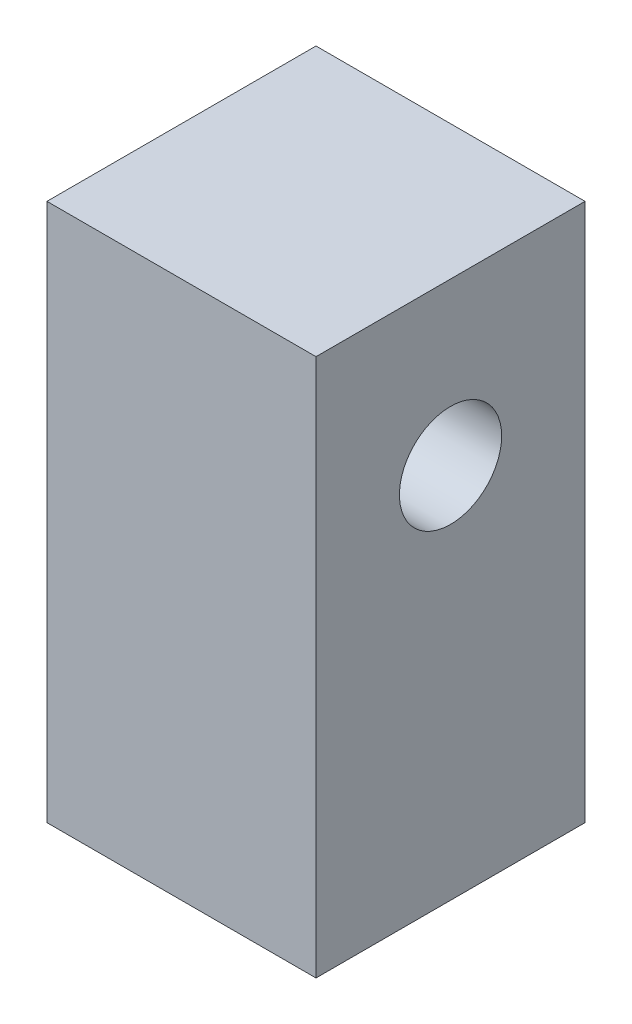
ISO-10303-21;
HEADER;
FILE_DESCRIPTION(('STEP AP214'),'2;1');
FILE_NAME('part.step','',(''),(''),'','','');
FILE_SCHEMA(('AUTOMOTIVE_DESIGN { 1 0 10303 214 1 1 1 1 }'));
ENDSEC;
DATA;
#1=APPLICATION_CONTEXT('core data for automotive mechanical design processes');
#2=APPLICATION_PROTOCOL_DEFINITION('international standard','automotive_design',2000,#1);
#3=PRODUCT_CONTEXT('',#1,'mechanical');
#4=PRODUCT('Part','Part','',(#3));
#5=PRODUCT_RELATED_PRODUCT_CATEGORY('part','',(#4));
#6=PRODUCT_DEFINITION_FORMATION('','',#4);
#7=PRODUCT_DEFINITION_CONTEXT('part definition',#1,'design');
#8=PRODUCT_DEFINITION('design','',#6,#7);
#9=PRODUCT_DEFINITION_SHAPE('','',#8);
#10=(LENGTH_UNIT() NAMED_UNIT(*) SI_UNIT(.MILLI.,.METRE.));
#11=(NAMED_UNIT(*) PLANE_ANGLE_UNIT() SI_UNIT($,.RADIAN.));
#12=(NAMED_UNIT(*) SI_UNIT($,.STERADIAN.) SOLID_ANGLE_UNIT());
#13=UNCERTAINTY_MEASURE_WITH_UNIT(LENGTH_MEASURE(1.E-05),#10,'distance_accuracy_value','');
#14=(GEOMETRIC_REPRESENTATION_CONTEXT(3) GLOBAL_UNCERTAINTY_ASSIGNED_CONTEXT((#13)) GLOBAL_UNIT_ASSIGNED_CONTEXT((#10,
#11,#12)) REPRESENTATION_CONTEXT('',''));
#15=CARTESIAN_POINT('',(0.,0.,0.));
#16=DIRECTION('',(0.,0.,1.));
#17=DIRECTION('',(1.,0.,0.));
#18=AXIS2_PLACEMENT_3D('',#15,#16,#17);
#19=CARTESIAN_POINT('',(-6.35000000000001,25.4,-6.35000000000001));
#20=DIRECTION('',(1.,0.,0.));
#21=DIRECTION('',(0.,0.,-1.));
#22=AXIS2_PLACEMENT_3D('',#19,#20,#21);
#23=PLANE('',#22);
#24=CARTESIAN_POINT('',(-6.35000000000002,17.78,0.));
#25=DIRECTION('',(1.,0.,0.));
#26=DIRECTION('',(0.,0.,-1.));
#27=AXIS2_PLACEMENT_3D('',#24,#25,#26);
#28=CIRCLE('',#27,2.413);
#29=CARTESIAN_POINT('',(-6.35000000000002,17.78,-2.413));
#30=VERTEX_POINT('',#29);
#31=EDGE_CURVE('E100',#30,#30,#28,.T.);
#32=ORIENTED_EDGE('',*,*,#31,.T.);
#33=EDGE_LOOP('',(#32));
#34=FACE_BOUND('',#33,.T.);
#35=DIRECTION('',(0.,0.,1.));
#36=VECTOR('',#35,1.);
#37=CARTESIAN_POINT('',(-6.35000000000001,0.,-6.35000000000001));
#38=LINE('',#37,#36);
#39=CARTESIAN_POINT('',(-6.35000000000001,0.,-6.35000000000001));
#40=VERTEX_POINT('',#39);
#41=CARTESIAN_POINT('',(-6.35000000000002,0.,6.34999999999999));
#42=VERTEX_POINT('',#41);
#43=EDGE_CURVE('E97',#40,#42,#38,.T.);
#44=ORIENTED_EDGE('',*,*,#43,.T.);
#45=DIRECTION('',(0.,-1.,0.));
#46=VECTOR('',#45,1.);
#47=CARTESIAN_POINT('',(-6.35000000000002,25.4,6.34999999999999));
#48=LINE('',#47,#46);
#49=CARTESIAN_POINT('',(-6.35000000000002,25.4,6.34999999999999));
#50=VERTEX_POINT('',#49);
#51=EDGE_CURVE('E11',#50,#42,#48,.T.);
#52=ORIENTED_EDGE('',*,*,#51,.F.);
#53=DIRECTION('',(0.,0.,1.));
#54=VECTOR('',#53,1.);
#55=CARTESIAN_POINT('',(-6.35000000000001,25.4,-6.35000000000001));
#56=LINE('',#55,#54);
#57=CARTESIAN_POINT('',(-6.35000000000001,25.4,-6.35000000000001));
#58=VERTEX_POINT('',#57);
#59=EDGE_CURVE('E85',#58,#50,#56,.T.);
#60=ORIENTED_EDGE('',*,*,#59,.F.);
#61=DIRECTION('',(0.,-1.,0.));
#62=VECTOR('',#61,1.);
#63=CARTESIAN_POINT('',(-6.35000000000001,25.4,-6.35000000000001));
#64=LINE('',#63,#62);
#65=EDGE_CURVE('E93',#58,#40,#64,.T.);
#66=ORIENTED_EDGE('',*,*,#65,.T.);
#67=EDGE_LOOP('',(#44,#52,#60,#66));
#68=FACE_BOUND('',#67,.T.);
#69=ADVANCED_FACE('F34',(#34,#68),#23,.F.);
#70=CARTESIAN_POINT('',(-6.35000000000002,25.4,6.34999999999999));
#71=DIRECTION('',(0.,0.,-1.));
#72=DIRECTION('',(-1.,0.,0.));
#73=AXIS2_PLACEMENT_3D('',#70,#71,#72);
#74=PLANE('',#73);
#75=DIRECTION('',(1.,0.,0.));
#76=VECTOR('',#75,1.);
#77=CARTESIAN_POINT('',(-6.35000000000002,0.,6.34999999999999));
#78=LINE('',#77,#76);
#79=CARTESIAN_POINT('',(6.35,0.,6.34999999999999));
#80=VERTEX_POINT('',#79);
#81=EDGE_CURVE('E89',#42,#80,#78,.T.);
#82=ORIENTED_EDGE('',*,*,#81,.T.);
#83=DIRECTION('',(0.,-1.,0.));
#84=VECTOR('',#83,1.);
#85=CARTESIAN_POINT('',(6.35,25.4,6.34999999999999));
#86=LINE('',#85,#84);
#87=CARTESIAN_POINT('',(6.35,25.4,6.34999999999999));
#88=VERTEX_POINT('',#87);
#89=EDGE_CURVE('E42',#88,#80,#86,.T.);
#90=ORIENTED_EDGE('',*,*,#89,.F.);
#91=DIRECTION('',(1.,0.,0.));
#92=VECTOR('',#91,1.);
#93=CARTESIAN_POINT('',(-6.35000000000002,25.4,6.34999999999999));
#94=LINE('',#93,#92);
#95=EDGE_CURVE('E80',#50,#88,#94,.T.);
#96=ORIENTED_EDGE('',*,*,#95,.F.);
#97=ORIENTED_EDGE('',*,*,#51,.T.);
#98=EDGE_LOOP('',(#82,#90,#96,#97));
#99=FACE_BOUND('',#98,.T.);
#100=ADVANCED_FACE('F88',(#99),#74,.F.);
#101=CARTESIAN_POINT('',(6.34999999999999,25.4,-6.35000000000001));
#102=DIRECTION('',(-1.,0.,0.));
#103=DIRECTION('',(0.,0.,1.));
#104=AXIS2_PLACEMENT_3D('',#101,#102,#103);
#105=PLANE('',#104);
#106=CARTESIAN_POINT('',(6.35,17.78,0.));
#107=DIRECTION('',(1.,0.,0.));
#108=DIRECTION('',(0.,0.,-1.));
#109=AXIS2_PLACEMENT_3D('',#106,#107,#108);
#110=CIRCLE('',#109,2.413);
#111=CARTESIAN_POINT('',(6.35,17.78,-2.413));
#112=VERTEX_POINT('',#111);
#113=EDGE_CURVE('E111',#112,#112,#110,.T.);
#114=ORIENTED_EDGE('',*,*,#113,.F.);
#115=EDGE_LOOP('',(#114));
#116=FACE_BOUND('',#115,.T.);
#117=DIRECTION('',(0.,0.,-1.));
#118=VECTOR('',#117,1.);
#119=CARTESIAN_POINT('',(6.34999999999999,0.,-6.35000000000001));
#120=LINE('',#119,#118);
#121=CARTESIAN_POINT('',(6.34999999999999,0.,-6.35000000000001));
#122=VERTEX_POINT('',#121);
#123=EDGE_CURVE('E67',#80,#122,#120,.T.);
#124=ORIENTED_EDGE('',*,*,#123,.T.);
#125=DIRECTION('',(0.,-1.,0.));
#126=VECTOR('',#125,1.);
#127=CARTESIAN_POINT('',(6.34999999999999,25.4,-6.35000000000001));
#128=LINE('',#127,#126);
#129=CARTESIAN_POINT('',(6.34999999999999,25.4,-6.35000000000001));
#130=VERTEX_POINT('',#129);
#131=EDGE_CURVE('E90',#130,#122,#128,.T.);
#132=ORIENTED_EDGE('',*,*,#131,.F.);
#133=DIRECTION('',(0.,0.,-1.));
#134=VECTOR('',#133,1.);
#135=CARTESIAN_POINT('',(6.34999999999999,25.4,-6.35000000000001));
#136=LINE('',#135,#134);
#137=EDGE_CURVE('E83',#88,#130,#136,.T.);
#138=ORIENTED_EDGE('',*,*,#137,.F.);
#139=ORIENTED_EDGE('',*,*,#89,.T.);
#140=EDGE_LOOP('',(#124,#132,#138,#139));
#141=FACE_BOUND('',#140,.T.);
#142=ADVANCED_FACE('F91',(#116,#141),#105,.F.);
#143=CARTESIAN_POINT('',(-6.35000000000001,25.4,-6.35000000000001));
#144=DIRECTION('',(0.,0.,1.));
#145=DIRECTION('',(1.,0.,0.));
#146=AXIS2_PLACEMENT_3D('',#143,#144,#145);
#147=PLANE('',#146);
#148=DIRECTION('',(-1.,0.,0.));
#149=VECTOR('',#148,1.);
#150=CARTESIAN_POINT('',(-6.35000000000001,0.,-6.35000000000001));
#151=LINE('',#150,#149);
#152=EDGE_CURVE('E73',#122,#40,#151,.T.);
#153=ORIENTED_EDGE('',*,*,#152,.T.);
#154=ORIENTED_EDGE('',*,*,#65,.F.);
#155=DIRECTION('',(-1.,0.,0.));
#156=VECTOR('',#155,1.);
#157=CARTESIAN_POINT('',(-6.35000000000001,25.4,-6.35000000000001));
#158=LINE('',#157,#156);
#159=EDGE_CURVE('E50',#130,#58,#158,.T.);
#160=ORIENTED_EDGE('',*,*,#159,.F.);
#161=ORIENTED_EDGE('',*,*,#131,.T.);
#162=EDGE_LOOP('',(#153,#154,#160,#161));
#163=FACE_BOUND('',#162,.T.);
#164=ADVANCED_FACE('F105',(#163),#147,.F.);
#165=CARTESIAN_POINT('',(-6.35000000000002,25.4,6.34999999999999));
#166=DIRECTION('',(0.,1.,0.));
#167=DIRECTION('',(0.,0.,1.));
#168=AXIS2_PLACEMENT_3D('',#165,#166,#167);
#169=PLANE('',#168);
#170=ORIENTED_EDGE('',*,*,#59,.T.);
#171=ORIENTED_EDGE('',*,*,#95,.T.);
#172=ORIENTED_EDGE('',*,*,#137,.T.);
#173=ORIENTED_EDGE('',*,*,#159,.T.);
#174=EDGE_LOOP('',(#170,#171,#172,#173));
#175=FACE_BOUND('',#174,.T.);
#176=ADVANCED_FACE('F81',(#175),#169,.T.);
#177=CARTESIAN_POINT('',(-6.35000000000002,0.,6.34999999999999));
#178=DIRECTION('',(0.,1.,0.));
#179=DIRECTION('',(0.,0.,1.));
#180=AXIS2_PLACEMENT_3D('',#177,#178,#179);
#181=PLANE('',#180);
#182=ORIENTED_EDGE('',*,*,#43,.F.);
#183=ORIENTED_EDGE('',*,*,#152,.F.);
#184=ORIENTED_EDGE('',*,*,#123,.F.);
#185=ORIENTED_EDGE('',*,*,#81,.F.);
#186=EDGE_LOOP('',(#182,#183,#184,#185));
#187=FACE_BOUND('',#186,.T.);
#188=ADVANCED_FACE('F108',(#187),#181,.F.);
#189=CARTESIAN_POINT('',(-6.35000000000002,17.78,0.));
#190=DIRECTION('',(1.,0.,0.));
#191=DIRECTION('',(0.,0.,-1.));
#192=AXIS2_PLACEMENT_3D('',#189,#190,#191);
#193=CYLINDRICAL_SURFACE('',#192,2.413);
#194=CARTESIAN_POINT('',(-6.35000000000002,17.78,-2.413));
#195=CARTESIAN_POINT('',(-6.21770833333335,17.78,-2.413));
#196=CARTESIAN_POINT('',(-6.08541666666669,17.78,-2.413));
#197=CARTESIAN_POINT('',(-5.82083333333335,17.78,-2.413));
#198=CARTESIAN_POINT('',(-5.68854166666669,17.78,-2.413));
#199=CARTESIAN_POINT('',(-5.42395833333335,17.78,-2.413));
#200=CARTESIAN_POINT('',(-5.29166666666668,17.78,-2.413));
#201=CARTESIAN_POINT('',(-5.02708333333335,17.78,-2.413));
#202=CARTESIAN_POINT('',(-4.89479166666668,17.78,-2.413));
#203=CARTESIAN_POINT('',(-4.63020833333335,17.78,-2.413));
#204=CARTESIAN_POINT('',(-4.49791666666668,17.78,-2.413));
#205=CARTESIAN_POINT('',(-4.23333333333335,17.78,-2.413));
#206=CARTESIAN_POINT('',(-4.10104166666668,17.78,-2.413));
#207=CARTESIAN_POINT('',(-3.83645833333335,17.78,-2.413));
#208=CARTESIAN_POINT('',(-3.70416666666668,17.78,-2.413));
#209=CARTESIAN_POINT('',(-3.43958333333335,17.78,-2.413));
#210=CARTESIAN_POINT('',(-3.30729166666668,17.78,-2.413));
#211=CARTESIAN_POINT('',(-3.04270833333335,17.78,-2.413));
#212=CARTESIAN_POINT('',(-2.91041666666668,17.78,-2.413));
#213=CARTESIAN_POINT('',(-2.64583333333335,17.78,-2.413));
#214=CARTESIAN_POINT('',(-2.51354166666668,17.78,-2.413));
#215=CARTESIAN_POINT('',(-2.24895833333335,17.78,-2.413));
#216=CARTESIAN_POINT('',(-2.11666666666668,17.78,-2.413));
#217=CARTESIAN_POINT('',(-1.85208333333335,17.78,-2.413));
#218=CARTESIAN_POINT('',(-1.71979166666668,17.78,-2.413));
#219=CARTESIAN_POINT('',(-1.45520833333335,17.78,-2.413));
#220=CARTESIAN_POINT('',(-1.32291666666668,17.78,-2.413));
#221=CARTESIAN_POINT('',(-1.05833333333335,17.78,-2.413));
#222=CARTESIAN_POINT('',(-0.926041666666678,17.78,-2.413));
#223=CARTESIAN_POINT('',(-0.661458333333345,17.78,-2.413));
#224=CARTESIAN_POINT('',(-0.529166666666678,17.78,-2.413));
#225=CARTESIAN_POINT('',(-0.264583333333344,17.78,-2.413));
#226=CARTESIAN_POINT('',(-0.132291666666677,17.78,-2.413));
#227=CARTESIAN_POINT('',(0.132291666666656,17.78,-2.413));
#228=CARTESIAN_POINT('',(0.264583333333323,17.78,-2.413));
#229=CARTESIAN_POINT('',(0.529166666666657,17.78,-2.413));
#230=CARTESIAN_POINT('',(0.661458333333324,17.78,-2.413));
#231=CARTESIAN_POINT('',(0.926041666666657,17.78,-2.413));
#232=CARTESIAN_POINT('',(1.05833333333332,17.78,-2.413));
#233=CARTESIAN_POINT('',(1.32291666666666,17.78,-2.413));
#234=CARTESIAN_POINT('',(1.45520833333332,17.78,-2.413));
#235=CARTESIAN_POINT('',(1.71979166666666,17.78,-2.413));
#236=CARTESIAN_POINT('',(1.85208333333332,17.78,-2.413));
#237=CARTESIAN_POINT('',(2.11666666666666,17.78,-2.413));
#238=CARTESIAN_POINT('',(2.24895833333332,17.78,-2.413));
#239=CARTESIAN_POINT('',(2.51354166666666,17.78,-2.413));
#240=CARTESIAN_POINT('',(2.64583333333333,17.78,-2.413));
#241=CARTESIAN_POINT('',(2.91041666666666,17.78,-2.413));
#242=CARTESIAN_POINT('',(3.04270833333333,17.78,-2.413));
#243=CARTESIAN_POINT('',(3.30729166666666,17.78,-2.413));
#244=CARTESIAN_POINT('',(3.43958333333333,17.78,-2.413));
#245=CARTESIAN_POINT('',(3.70416666666666,17.78,-2.413));
#246=CARTESIAN_POINT('',(3.83645833333333,17.78,-2.413));
#247=CARTESIAN_POINT('',(4.10104166666666,17.78,-2.413));
#248=CARTESIAN_POINT('',(4.23333333333333,17.78,-2.413));
#249=CARTESIAN_POINT('',(4.49791666666666,17.78,-2.413));
#250=CARTESIAN_POINT('',(4.63020833333333,17.78,-2.413));
#251=CARTESIAN_POINT('',(4.89479166666666,17.78,-2.413));
#252=CARTESIAN_POINT('',(5.02708333333333,17.78,-2.413));
#253=CARTESIAN_POINT('',(5.29166666666666,17.78,-2.413));
#254=CARTESIAN_POINT('',(5.42395833333333,17.78,-2.413));
#255=CARTESIAN_POINT('',(5.68854166666666,17.78,-2.413));
#256=CARTESIAN_POINT('',(5.82083333333333,17.78,-2.413));
#257=CARTESIAN_POINT('',(6.08541666666666,17.78,-2.413));
#258=CARTESIAN_POINT('',(6.21770833333333,17.78,-2.413));
#259=CARTESIAN_POINT('',(6.35,17.78,-2.413));
#260=B_SPLINE_CURVE_WITH_KNOTS('',3,(#194,#195,#196,#197,#198,#199,#200,#201,#202,#203,#204,
#205,#206,#207,#208,#209,#210,#211,#212,#213,#214,#215,#216,#217,#218,#219,#220,#221,#222,#223,
#224,#225,#226,#227,#228,#229,#230,#231,#232,#233,#234,#235,#236,#237,#238,#239,#240,#241,#242,
#243,#244,#245,#246,#247,#248,#249,#250,#251,#252,#253,#254,#255,#256,#257,#258,#259),
.UNSPECIFIED.,.F.,.F.,(4,2,2,2,2,2,2,2,2,2,2,2,2,2,2,2,2,2,2,2,2,2,2,2,2,2,2,2,2,2,2,2,4),(0.,
0.396875000000001,0.793750000000001,1.190625,1.5875,1.984375,2.38125,2.778125,3.175,3.571875,
3.96875000000001,4.36562500000001,4.76250000000001,5.15937500000001,5.55625000000001,
5.95312500000001,6.35000000000001,6.74687500000001,7.14375000000001,7.54062500000001,
7.93750000000001,8.33437500000001,8.73125000000001,9.12812500000001,9.52500000000001,
9.92187500000001,10.31875,10.715625,11.1125,11.509375,11.90625,12.303125,12.7),.UNSPECIFIED.);
#261=EDGE_CURVE('BSEAM118',#30,#112,#260,.T.);
#262=ORIENTED_EDGE('',*,*,#31,.F.);
#263=ORIENTED_EDGE('',*,*,#113,.T.);
#264=ORIENTED_EDGE('',*,*,#261,.T.);
#265=ORIENTED_EDGE('',*,*,#261,.F.);
#266=EDGE_LOOP('',(#262,#264,#263,#265));
#267=FACE_BOUND('',#266,.T.);
#268=ADVANCED_FACE('F118',(#267),#193,.F.);
#269=CLOSED_SHELL('',(#69,#100,#142,#164,#176,#188,#268));
#270=MANIFOLD_SOLID_BREP('B2',#269);
#271=ADVANCED_BREP_SHAPE_REPRESENTATION('',(#18,#270),#14);
#272=SHAPE_DEFINITION_REPRESENTATION(#9,#271);
ENDSEC;
END-ISO-10303-21;
